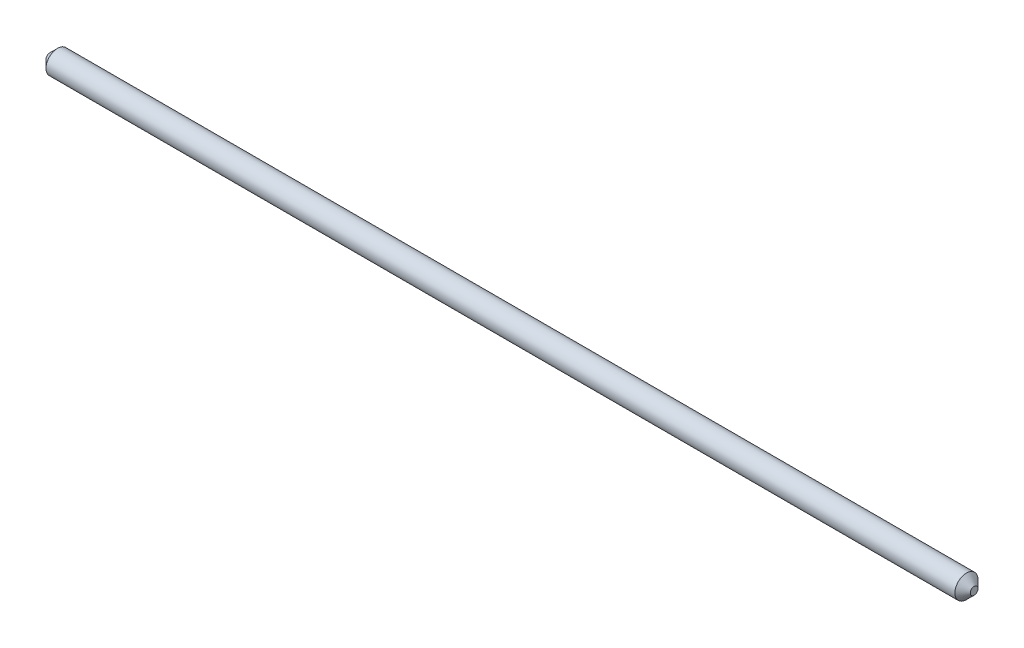
ISO-10303-21;
HEADER;
FILE_DESCRIPTION(('STEP AP214'),'2;1');
FILE_NAME('part.step','',(''),(''),'','','');
FILE_SCHEMA(('AUTOMOTIVE_DESIGN { 1 0 10303 214 1 1 1 1 }'));
ENDSEC;
DATA;
#1=APPLICATION_CONTEXT('core data for automotive mechanical design processes');
#2=APPLICATION_PROTOCOL_DEFINITION('international standard','automotive_design',2000,#1);
#3=PRODUCT_CONTEXT('',#1,'mechanical');
#4=PRODUCT('Part','Part','',(#3));
#5=PRODUCT_RELATED_PRODUCT_CATEGORY('part','',(#4));
#6=PRODUCT_DEFINITION_FORMATION('','',#4);
#7=PRODUCT_DEFINITION_CONTEXT('part definition',#1,'design');
#8=PRODUCT_DEFINITION('design','',#6,#7);
#9=PRODUCT_DEFINITION_SHAPE('','',#8);
#10=(LENGTH_UNIT() NAMED_UNIT(*) SI_UNIT(.MILLI.,.METRE.));
#11=(NAMED_UNIT(*) PLANE_ANGLE_UNIT() SI_UNIT($,.RADIAN.));
#12=(NAMED_UNIT(*) SI_UNIT($,.STERADIAN.) SOLID_ANGLE_UNIT());
#13=UNCERTAINTY_MEASURE_WITH_UNIT(LENGTH_MEASURE(1.E-05),#10,'distance_accuracy_value','');
#14=(GEOMETRIC_REPRESENTATION_CONTEXT(3) GLOBAL_UNCERTAINTY_ASSIGNED_CONTEXT((#13)) GLOBAL_UNIT_ASSIGNED_CONTEXT((#10,
#11,#12)) REPRESENTATION_CONTEXT('',''));
#15=CARTESIAN_POINT('',(0.,0.,0.));
#16=DIRECTION('',(0.,0.,1.));
#17=DIRECTION('',(1.,0.,0.));
#18=AXIS2_PLACEMENT_3D('',#15,#16,#17);
#19=CARTESIAN_POINT('',(60.,0.,0.));
#20=DIRECTION('',(-1.,0.,0.));
#21=DIRECTION('',(0.,0.,1.));
#22=AXIS2_PLACEMENT_3D('',#19,#20,#21);
#23=CYLINDRICAL_SURFACE('',#22,1.5);
#24=CARTESIAN_POINT('',(-59.,0.,0.));
#25=DIRECTION('',(1.,0.,0.));
#26=DIRECTION('',(0.,0.,-1.));
#27=AXIS2_PLACEMENT_3D('',#24,#25,#26);
#28=CIRCLE('',#27,1.5);
#29=CARTESIAN_POINT('',(-59.,0.,-1.5));
#30=VERTEX_POINT('',#29);
#31=EDGE_CURVE('E51',#30,#30,#28,.T.);
#32=ORIENTED_EDGE('',*,*,#31,.T.);
#33=EDGE_LOOP('',(#32));
#34=FACE_BOUND('',#33,.T.);
#35=CARTESIAN_POINT('',(59.,0.,0.));
#36=DIRECTION('',(1.,0.,0.));
#37=DIRECTION('',(0.,0.,-1.));
#38=AXIS2_PLACEMENT_3D('',#35,#36,#37);
#39=CIRCLE('',#38,1.5);
#40=CARTESIAN_POINT('',(59.,0.,1.5));
#41=VERTEX_POINT('',#40);
#42=EDGE_CURVE('E55',#41,#41,#39,.F.);
#43=ORIENTED_EDGE('',*,*,#42,.T.);
#44=EDGE_LOOP('',(#43));
#45=FACE_BOUND('',#44,.T.);
#46=ADVANCED_FACE('F39',(#34,#45),#23,.T.);
#47=CARTESIAN_POINT('',(60.,0.,0.));
#48=DIRECTION('',(1.,0.,0.));
#49=DIRECTION('',(0.,0.,-1.));
#50=AXIS2_PLACEMENT_3D('',#47,#48,#49);
#51=PLANE('',#50);
#52=CARTESIAN_POINT('',(60.,0.,0.));
#53=DIRECTION('',(1.,0.,0.));
#54=DIRECTION('',(0.,0.,-1.));
#55=AXIS2_PLACEMENT_3D('',#52,#53,#54);
#56=CIRCLE('',#55,0.5);
#57=CARTESIAN_POINT('',(60.,0.,0.500000000000004));
#58=VERTEX_POINT('',#57);
#59=EDGE_CURVE('E10',#58,#58,#56,.T.);
#60=ORIENTED_EDGE('',*,*,#59,.T.);
#61=EDGE_LOOP('',(#60));
#62=FACE_BOUND('',#61,.T.);
#63=ADVANCED_FACE('F71',(#62),#51,.T.);
#64=CARTESIAN_POINT('',(-60.,0.,0.));
#65=DIRECTION('',(1.,0.,0.));
#66=DIRECTION('',(0.,0.,-1.));
#67=AXIS2_PLACEMENT_3D('',#64,#65,#66);
#68=PLANE('',#67);
#69=CARTESIAN_POINT('',(-60.,0.,0.));
#70=DIRECTION('',(1.,0.,0.));
#71=DIRECTION('',(0.,0.,-1.));
#72=AXIS2_PLACEMENT_3D('',#69,#70,#71);
#73=CIRCLE('',#72,0.500000000000001);
#74=CARTESIAN_POINT('',(-60.,0.,-0.499999999999997));
#75=VERTEX_POINT('',#74);
#76=EDGE_CURVE('E47',#75,#75,#73,.F.);
#77=ORIENTED_EDGE('',*,*,#76,.T.);
#78=EDGE_LOOP('',(#77));
#79=FACE_BOUND('',#78,.T.);
#80=ADVANCED_FACE('F68',(#79),#68,.F.);
#81=CARTESIAN_POINT('',(-59.,0.,0.));
#82=DIRECTION('',(1.,0.,0.));
#83=DIRECTION('',(0.,0.,-1.));
#84=AXIS2_PLACEMENT_3D('',#81,#82,#83);
#85=CONICAL_SURFACE('',#84,1.5,0.785398163397448);
#86=CARTESIAN_POINT('',(-60.,0.,-0.499999999999997));
#87=CARTESIAN_POINT('',(-59.9895833333333,0.,-0.510416666666663));
#88=CARTESIAN_POINT('',(-59.9791666666667,0.,-0.52083333333333));
#89=CARTESIAN_POINT('',(-59.9583333333333,0.,-0.541666666666664));
#90=CARTESIAN_POINT('',(-59.9479166666667,0.,-0.552083333333331));
#91=CARTESIAN_POINT('',(-59.9270833333333,0.,-0.572916666666664));
#92=CARTESIAN_POINT('',(-59.9166666666667,0.,-0.583333333333331));
#93=CARTESIAN_POINT('',(-59.8958333333333,0.,-0.604166666666663));
#94=CARTESIAN_POINT('',(-59.8854166666667,0.,-0.61458333333333));
#95=CARTESIAN_POINT('',(-59.8645833333333,0.,-0.635416666666663));
#96=CARTESIAN_POINT('',(-59.8541666666667,0.,-0.64583333333333));
#97=CARTESIAN_POINT('',(-59.8333333333333,0.,-0.666666666666664));
#98=CARTESIAN_POINT('',(-59.8229166666667,0.,-0.677083333333331));
#99=CARTESIAN_POINT('',(-59.8020833333333,0.,-0.697916666666664));
#100=CARTESIAN_POINT('',(-59.7916666666667,0.,-0.708333333333331));
#101=CARTESIAN_POINT('',(-59.7708333333333,0.,-0.729166666666663));
#102=CARTESIAN_POINT('',(-59.7604166666667,0.,-0.73958333333333));
#103=CARTESIAN_POINT('',(-59.7395833333333,0.,-0.760416666666663));
#104=CARTESIAN_POINT('',(-59.7291666666667,0.,-0.77083333333333));
#105=CARTESIAN_POINT('',(-59.7083333333333,0.,-0.791666666666664));
#106=CARTESIAN_POINT('',(-59.6979166666667,0.,-0.802083333333331));
#107=CARTESIAN_POINT('',(-59.6770833333333,0.,-0.822916666666664));
#108=CARTESIAN_POINT('',(-59.6666666666667,0.,-0.833333333333331));
#109=CARTESIAN_POINT('',(-59.6458333333333,0.,-0.854166666666663));
#110=CARTESIAN_POINT('',(-59.6354166666667,0.,-0.86458333333333));
#111=CARTESIAN_POINT('',(-59.6145833333333,0.,-0.885416666666663));
#112=CARTESIAN_POINT('',(-59.6041666666667,0.,-0.89583333333333));
#113=CARTESIAN_POINT('',(-59.5833333333333,0.,-0.916666666666664));
#114=CARTESIAN_POINT('',(-59.5729166666667,0.,-0.927083333333331));
#115=CARTESIAN_POINT('',(-59.5520833333333,0.,-0.947916666666664));
#116=CARTESIAN_POINT('',(-59.5416666666667,0.,-0.958333333333331));
#117=CARTESIAN_POINT('',(-59.5208333333333,0.,-0.979166666666663));
#118=CARTESIAN_POINT('',(-59.5104166666667,0.,-0.98958333333333));
#119=CARTESIAN_POINT('',(-59.4895833333333,0.,-1.01041666666666));
#120=CARTESIAN_POINT('',(-59.4791666666667,0.,-1.02083333333333));
#121=CARTESIAN_POINT('',(-59.4583333333333,0.,-1.04166666666666));
#122=CARTESIAN_POINT('',(-59.4479166666667,0.,-1.05208333333333));
#123=CARTESIAN_POINT('',(-59.4270833333333,0.,-1.07291666666666));
#124=CARTESIAN_POINT('',(-59.4166666666667,0.,-1.08333333333333));
#125=CARTESIAN_POINT('',(-59.3958333333333,0.,-1.10416666666666));
#126=CARTESIAN_POINT('',(-59.3854166666667,0.,-1.11458333333333));
#127=CARTESIAN_POINT('',(-59.3645833333333,0.,-1.13541666666666));
#128=CARTESIAN_POINT('',(-59.3541666666667,0.,-1.14583333333333));
#129=CARTESIAN_POINT('',(-59.3333333333333,0.,-1.16666666666666));
#130=CARTESIAN_POINT('',(-59.3229166666667,0.,-1.17708333333333));
#131=CARTESIAN_POINT('',(-59.3020833333333,0.,-1.19791666666666));
#132=CARTESIAN_POINT('',(-59.2916666666667,0.,-1.20833333333333));
#133=CARTESIAN_POINT('',(-59.2708333333333,0.,-1.22916666666666));
#134=CARTESIAN_POINT('',(-59.2604166666667,0.,-1.23958333333333));
#135=CARTESIAN_POINT('',(-59.2395833333333,0.,-1.26041666666666));
#136=CARTESIAN_POINT('',(-59.2291666666667,0.,-1.27083333333333));
#137=CARTESIAN_POINT('',(-59.2083333333333,0.,-1.29166666666666));
#138=CARTESIAN_POINT('',(-59.1979166666667,0.,-1.30208333333333));
#139=CARTESIAN_POINT('',(-59.1770833333333,0.,-1.32291666666666));
#140=CARTESIAN_POINT('',(-59.1666666666667,0.,-1.33333333333333));
#141=CARTESIAN_POINT('',(-59.1458333333333,0.,-1.35416666666666));
#142=CARTESIAN_POINT('',(-59.1354166666667,0.,-1.36458333333333));
#143=CARTESIAN_POINT('',(-59.1145833333333,0.,-1.38541666666666));
#144=CARTESIAN_POINT('',(-59.1041666666667,0.,-1.39583333333333));
#145=CARTESIAN_POINT('',(-59.0833333333333,0.,-1.41666666666666));
#146=CARTESIAN_POINT('',(-59.0729166666667,0.,-1.42708333333333));
#147=CARTESIAN_POINT('',(-59.0520833333333,0.,-1.44791666666666));
#148=CARTESIAN_POINT('',(-59.0416666666667,0.,-1.45833333333333));
#149=CARTESIAN_POINT('',(-59.0208333333333,0.,-1.47916666666666));
#150=CARTESIAN_POINT('',(-59.0104166666667,0.,-1.48958333333333));
#151=CARTESIAN_POINT('',(-59.,0.,-1.5));
#152=B_SPLINE_CURVE_WITH_KNOTS('',3,(#86,#87,#88,#89,#90,#91,#92,#93,#94,#95,#96,#97,#98,#99,
#100,#101,#102,#103,#104,#105,#106,#107,#108,#109,#110,#111,#112,#113,#114,#115,#116,#117,#118,
#119,#120,#121,#122,#123,#124,#125,#126,#127,#128,#129,#130,#131,#132,#133,#134,#135,#136,#137,
#138,#139,#140,#141,#142,#143,#144,#145,#146,#147,#148,#149,#150,#151),.UNSPECIFIED.,.F.,.F.,(4,
2,2,2,2,2,2,2,2,2,2,2,2,2,2,2,2,2,2,2,2,2,2,2,2,2,2,2,2,2,2,2,4),(0.,0.0441941738241567,
0.0883883476483135,0.132582521472475,0.176776695296637,0.220970869120794,0.26516504294495,
0.309359216769112,0.353553390593274,0.397747564417431,0.441941738241587,0.486135912065749,
0.530330085889911,0.574524259714068,0.618718433538224,0.662912607362386,0.707106781186548,
0.751300955010704,0.795495128834861,0.839689302659023,0.883883476483184,0.928077650307341,
0.972271824131498,1.01646599795566,1.06066017177982,1.10485434560398,1.14904851942814,
1.1932426932523,1.23743686707646,1.28163104090062,1.32582521472477,1.37001938854893,
1.4142135623731),.UNSPECIFIED.);
#153=EDGE_CURVE('BSEAM64',#75,#30,#152,.T.);
#154=ORIENTED_EDGE('',*,*,#76,.F.);
#155=ORIENTED_EDGE('',*,*,#31,.F.);
#156=ORIENTED_EDGE('',*,*,#153,.T.);
#157=ORIENTED_EDGE('',*,*,#153,.F.);
#158=EDGE_LOOP('',(#154,#156,#155,#157));
#159=FACE_BOUND('',#158,.T.);
#160=ADVANCED_FACE('F64',(#159),#85,.T.);
#161=CARTESIAN_POINT('',(60.,0.,0.));
#162=DIRECTION('',(-1.,0.,0.));
#163=DIRECTION('',(0.,0.,1.));
#164=AXIS2_PLACEMENT_3D('',#161,#162,#163);
#165=CONICAL_SURFACE('',#164,0.5,0.785398163397451);
#166=CARTESIAN_POINT('',(59.,0.,1.5));
#167=CARTESIAN_POINT('',(59.0104166666667,0.,1.48958333333334));
#168=CARTESIAN_POINT('',(59.0208333333333,0.,1.47916666666667));
#169=CARTESIAN_POINT('',(59.0416666666667,0.,1.45833333333334));
#170=CARTESIAN_POINT('',(59.0520833333333,0.,1.44791666666667));
#171=CARTESIAN_POINT('',(59.0729166666667,0.,1.42708333333334));
#172=CARTESIAN_POINT('',(59.0833333333333,0.,1.41666666666667));
#173=CARTESIAN_POINT('',(59.1041666666667,0.,1.39583333333334));
#174=CARTESIAN_POINT('',(59.1145833333333,0.,1.38541666666667));
#175=CARTESIAN_POINT('',(59.1354166666667,0.,1.36458333333334));
#176=CARTESIAN_POINT('',(59.1458333333333,0.,1.35416666666667));
#177=CARTESIAN_POINT('',(59.1666666666667,0.,1.33333333333334));
#178=CARTESIAN_POINT('',(59.1770833333333,0.,1.32291666666667));
#179=CARTESIAN_POINT('',(59.1979166666667,0.,1.30208333333334));
#180=CARTESIAN_POINT('',(59.2083333333333,0.,1.29166666666667));
#181=CARTESIAN_POINT('',(59.2291666666667,0.,1.27083333333334));
#182=CARTESIAN_POINT('',(59.2395833333333,0.,1.26041666666667));
#183=CARTESIAN_POINT('',(59.2604166666667,0.,1.23958333333334));
#184=CARTESIAN_POINT('',(59.2708333333333,0.,1.22916666666667));
#185=CARTESIAN_POINT('',(59.2916666666667,0.,1.20833333333334));
#186=CARTESIAN_POINT('',(59.3020833333333,0.,1.19791666666667));
#187=CARTESIAN_POINT('',(59.3229166666667,0.,1.17708333333334));
#188=CARTESIAN_POINT('',(59.3333333333333,0.,1.16666666666667));
#189=CARTESIAN_POINT('',(59.3541666666667,0.,1.14583333333334));
#190=CARTESIAN_POINT('',(59.3645833333333,0.,1.13541666666667));
#191=CARTESIAN_POINT('',(59.3854166666667,0.,1.11458333333334));
#192=CARTESIAN_POINT('',(59.3958333333333,0.,1.10416666666667));
#193=CARTESIAN_POINT('',(59.4166666666667,0.,1.08333333333334));
#194=CARTESIAN_POINT('',(59.4270833333333,0.,1.07291666666667));
#195=CARTESIAN_POINT('',(59.4479166666667,0.,1.05208333333334));
#196=CARTESIAN_POINT('',(59.4583333333333,0.,1.04166666666667));
#197=CARTESIAN_POINT('',(59.4791666666667,0.,1.02083333333334));
#198=CARTESIAN_POINT('',(59.4895833333333,0.,1.01041666666667));
#199=CARTESIAN_POINT('',(59.5104166666667,0.,0.989583333333337));
#200=CARTESIAN_POINT('',(59.5208333333333,0.,0.97916666666667));
#201=CARTESIAN_POINT('',(59.5416666666667,0.,0.958333333333337));
#202=CARTESIAN_POINT('',(59.5520833333333,0.,0.947916666666671));
#203=CARTESIAN_POINT('',(59.5729166666667,0.,0.927083333333338));
#204=CARTESIAN_POINT('',(59.5833333333333,0.,0.91666666666667));
#205=CARTESIAN_POINT('',(59.6041666666667,0.,0.895833333333337));
#206=CARTESIAN_POINT('',(59.6145833333333,0.,0.885416666666671));
#207=CARTESIAN_POINT('',(59.6354166666667,0.,0.864583333333338));
#208=CARTESIAN_POINT('',(59.6458333333333,0.,0.85416666666667));
#209=CARTESIAN_POINT('',(59.6666666666667,0.,0.833333333333336));
#210=CARTESIAN_POINT('',(59.6770833333333,0.,0.822916666666671));
#211=CARTESIAN_POINT('',(59.6979166666667,0.,0.802083333333338));
#212=CARTESIAN_POINT('',(59.7083333333333,0.,0.79166666666667));
#213=CARTESIAN_POINT('',(59.7291666666667,0.,0.770833333333337));
#214=CARTESIAN_POINT('',(59.7395833333333,0.,0.760416666666671));
#215=CARTESIAN_POINT('',(59.7604166666667,0.,0.739583333333338));
#216=CARTESIAN_POINT('',(59.7708333333333,0.,0.72916666666667));
#217=CARTESIAN_POINT('',(59.7916666666667,0.,0.708333333333337));
#218=CARTESIAN_POINT('',(59.8020833333333,0.,0.697916666666671));
#219=CARTESIAN_POINT('',(59.8229166666667,0.,0.677083333333338));
#220=CARTESIAN_POINT('',(59.8333333333333,0.,0.66666666666667));
#221=CARTESIAN_POINT('',(59.8541666666667,0.,0.645833333333337));
#222=CARTESIAN_POINT('',(59.8645833333333,0.,0.635416666666671));
#223=CARTESIAN_POINT('',(59.8854166666667,0.,0.614583333333338));
#224=CARTESIAN_POINT('',(59.8958333333333,0.,0.60416666666667));
#225=CARTESIAN_POINT('',(59.9166666666667,0.,0.583333333333336));
#226=CARTESIAN_POINT('',(59.9270833333333,0.,0.572916666666671));
#227=CARTESIAN_POINT('',(59.9479166666667,0.,0.552083333333338));
#228=CARTESIAN_POINT('',(59.9583333333333,0.,0.541666666666671));
#229=CARTESIAN_POINT('',(59.9791666666667,0.,0.520833333333336));
#230=CARTESIAN_POINT('',(59.9895833333333,0.,0.510416666666669));
#231=CARTESIAN_POINT('',(60.,0.,0.500000000000004));
#232=B_SPLINE_CURVE_WITH_KNOTS('',3,(#166,#167,#168,#169,#170,#171,#172,#173,#174,#175,#176,
#177,#178,#179,#180,#181,#182,#183,#184,#185,#186,#187,#188,#189,#190,#191,#192,#193,#194,#195,
#196,#197,#198,#199,#200,#201,#202,#203,#204,#205,#206,#207,#208,#209,#210,#211,#212,#213,#214,
#215,#216,#217,#218,#219,#220,#221,#222,#223,#224,#225,#226,#227,#228,#229,#230,#231),
.UNSPECIFIED.,.F.,.F.,(4,2,2,2,2,2,2,2,2,2,2,2,2,2,2,2,2,2,2,2,2,2,2,2,2,2,2,2,2,2,2,2,4),(0.,
0.0441941738241617,0.0883883476483185,0.13258252147248,0.176776695296637,0.220970869120799,
0.265165042944955,0.309359216769117,0.353553390593274,0.397747564417436,0.441941738241592,
0.486135912065754,0.530330085889911,0.574524259714073,0.618718433538229,0.662912607362391,
0.707106781186548,0.751300955010704,0.795495128834866,0.839689302659023,0.883883476483185,
0.928077650307341,0.972271824131503,1.01646599795566,1.06066017177982,1.10485434560398,
1.14904851942814,1.1932426932523,1.23743686707646,1.28163104090062,1.32582521472478,
1.37001938854893,1.4142135623731),.UNSPECIFIED.);
#233=EDGE_CURVE('BSEAM42',#41,#58,#232,.T.);
#234=ORIENTED_EDGE('',*,*,#42,.F.);
#235=ORIENTED_EDGE('',*,*,#59,.F.);
#236=ORIENTED_EDGE('',*,*,#233,.T.);
#237=ORIENTED_EDGE('',*,*,#233,.F.);
#238=EDGE_LOOP('',(#234,#236,#235,#237));
#239=FACE_BOUND('',#238,.T.);
#240=ADVANCED_FACE('F42',(#239),#165,.T.);
#241=CLOSED_SHELL('',(#46,#63,#80,#160,#240));
#242=MANIFOLD_SOLID_BREP('B2',#241);
#243=ADVANCED_BREP_SHAPE_REPRESENTATION('',(#18,#242),#14);
#244=SHAPE_DEFINITION_REPRESENTATION(#9,#243);
ENDSEC;
END-ISO-10303-21;
